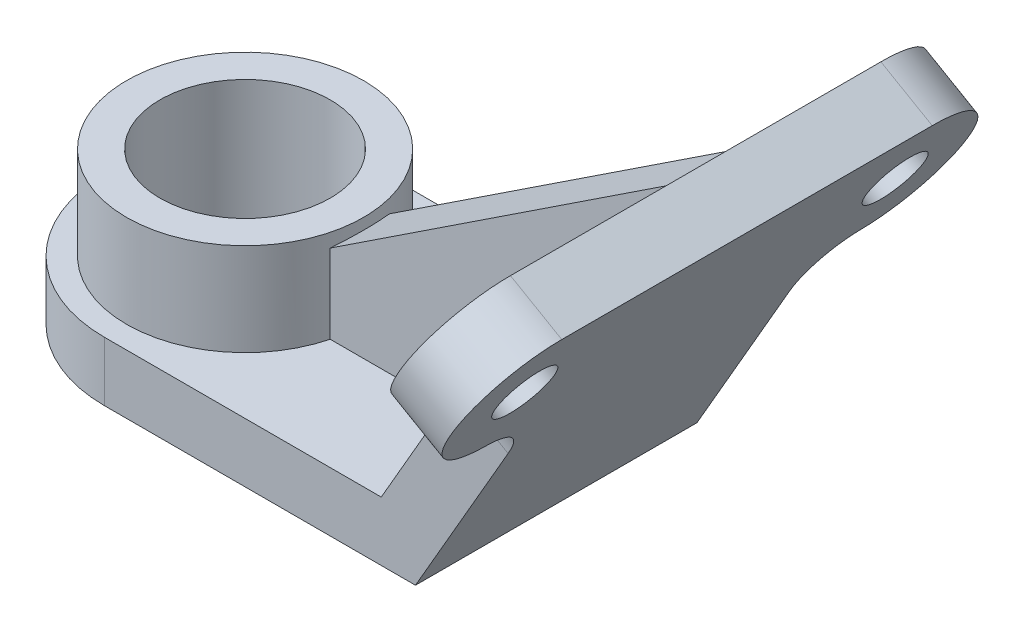
ISO-10303-21;
HEADER;
FILE_DESCRIPTION(('STEP AP214'),'2;1');
FILE_NAME('part.step','',(''),(''),'','','');
FILE_SCHEMA(('AUTOMOTIVE_DESIGN { 1 0 10303 214 1 1 1 1 }'));
ENDSEC;
DATA;
#1=APPLICATION_CONTEXT('core data for automotive mechanical design processes');
#2=APPLICATION_PROTOCOL_DEFINITION('international standard','automotive_design',2000,#1);
#3=PRODUCT_CONTEXT('',#1,'mechanical');
#4=PRODUCT('Part','Part','',(#3));
#5=PRODUCT_RELATED_PRODUCT_CATEGORY('part','',(#4));
#6=PRODUCT_DEFINITION_FORMATION('','',#4);
#7=PRODUCT_DEFINITION_CONTEXT('part definition',#1,'design');
#8=PRODUCT_DEFINITION('design','',#6,#7);
#9=PRODUCT_DEFINITION_SHAPE('','',#8);
#10=(LENGTH_UNIT() NAMED_UNIT(*) SI_UNIT(.MILLI.,.METRE.));
#11=(NAMED_UNIT(*) PLANE_ANGLE_UNIT() SI_UNIT($,.RADIAN.));
#12=(NAMED_UNIT(*) SI_UNIT($,.STERADIAN.) SOLID_ANGLE_UNIT());
#13=UNCERTAINTY_MEASURE_WITH_UNIT(LENGTH_MEASURE(1.E-05),#10,'distance_accuracy_value','');
#14=(GEOMETRIC_REPRESENTATION_CONTEXT(3) GLOBAL_UNCERTAINTY_ASSIGNED_CONTEXT((#13)) GLOBAL_UNIT_ASSIGNED_CONTEXT((#10,
#11,#12)) REPRESENTATION_CONTEXT('',''));
#15=CARTESIAN_POINT('',(0.,0.,0.));
#16=DIRECTION('',(0.,0.,1.));
#17=DIRECTION('',(1.,0.,0.));
#18=AXIS2_PLACEMENT_3D('',#15,#16,#17);
#19=CARTESIAN_POINT('',(112.762395692966,16.,38.));
#20=DIRECTION('',(0.86602540378444,-0.499999999999998,0.));
#21=DIRECTION('',(0.499999999999998,0.86602540378444,0.));
#22=AXIS2_PLACEMENT_3D('',#19,#20,#21);
#23=PLANE('',#22);
#24=CARTESIAN_POINT('',(149.643593539449,79.8801085141082,-50.000000000001));
#25=DIRECTION('',(-0.86602540378444,0.499999999999998,0.));
#26=DIRECTION('',(-0.499999999999998,-0.86602540378444,0.));
#27=AXIS2_PLACEMENT_3D('',#24,#25,#26);
#28=CIRCLE('',#27,7.99999999999999);
#29=CARTESIAN_POINT('',(145.643593539449,72.9519052838327,-50.000000000001));
#30=VERTEX_POINT('',#29);
#31=EDGE_CURVE('E216',#30,#30,#28,.F.);
#32=ORIENTED_EDGE('',*,*,#31,.T.);
#33=EDGE_LOOP('',(#32));
#34=FACE_BOUND('',#33,.T.);
#35=DIRECTION('',(-0.499999999999998,-0.86602540378444,0.));
#36=VECTOR('',#35,1.);
#37=CARTESIAN_POINT('',(112.762395692966,16.,-8.));
#38=LINE('',#37,#36);
#39=CARTESIAN_POINT('',(159.643593539449,97.2006165897973,-8.));
#40=VERTEX_POINT('',#39);
#41=CARTESIAN_POINT('',(112.762395692966,16.,-8.));
#42=VERTEX_POINT('',#41);
#43=EDGE_CURVE('E179',#40,#42,#38,.T.);
#44=ORIENTED_EDGE('',*,*,#43,.F.);
#45=DIRECTION('',(0.,0.,-1.));
#46=VECTOR('',#45,1.);
#47=CARTESIAN_POINT('',(159.643593539449,97.2006165897973,38.));
#48=LINE('',#47,#46);
#49=CARTESIAN_POINT('',(159.643593539449,97.2006165897973,-50.));
#50=VERTEX_POINT('',#49);
#51=EDGE_CURVE('E314',#40,#50,#48,.T.);
#52=ORIENTED_EDGE('',*,*,#51,.T.);
#53=CARTESIAN_POINT('',(149.643593539449,79.8801085141082,-50.000000000001));
#54=DIRECTION('',(-0.86602540378444,0.499999999999998,0.));
#55=DIRECTION('',(-0.499999999999998,-0.86602540378444,0.));
#56=AXIS2_PLACEMENT_3D('',#53,#54,#55);
#57=CIRCLE('',#56,20.0000000000002);
#58=CARTESIAN_POINT('',(139.648185962194,62.5675547479437,-50.6060606060615));
#59=VERTEX_POINT('',#58);
#60=EDGE_CURVE('E226',#59,#50,#57,.F.);
#61=ORIENTED_EDGE('',*,*,#60,.F.);
#62=CARTESIAN_POINT('',(133.151171036978,51.3143947999367,-51.0000000000008));
#63=DIRECTION('',(-0.86602540378444,0.499999999999998,0.));
#64=DIRECTION('',(-0.499999999999998,-0.86602540378444,0.));
#65=AXIS2_PLACEMENT_3D('',#62,#63,#64);
#66=CIRCLE('',#65,13.);
#67=CARTESIAN_POINT('',(133.151171036978,51.3143947999368,-38.));
#68=VERTEX_POINT('',#67);
#69=EDGE_CURVE('E221',#59,#68,#66,.F.);
#70=ORIENTED_EDGE('',*,*,#69,.T.);
#71=DIRECTION('',(-0.499999999999998,-0.86602540378444,0.));
#72=VECTOR('',#71,1.);
#73=CARTESIAN_POINT('',(112.762395692966,16.,-38.));
#74=LINE('',#73,#72);
#75=CARTESIAN_POINT('',(112.762395692966,16.,-38.));
#76=VERTEX_POINT('',#75);
#77=EDGE_CURVE('E304',#68,#76,#74,.T.);
#78=ORIENTED_EDGE('',*,*,#77,.T.);
#79=DIRECTION('',(0.,0.,-1.));
#80=VECTOR('',#79,1.);
#81=CARTESIAN_POINT('',(112.762395692966,16.,38.));
#82=LINE('',#81,#80);
#83=EDGE_CURVE('E296',#42,#76,#82,.T.);
#84=ORIENTED_EDGE('',*,*,#83,.F.);
#85=EDGE_LOOP('',(#44,#52,#61,#70,#78,#84));
#86=FACE_BOUND('',#85,.T.);
#87=ADVANCED_FACE('F47',(#34,#86),#23,.F.);
#88=CARTESIAN_POINT('',(0.,0.,38.));
#89=DIRECTION('',(0.,1.,0.));
#90=DIRECTION('',(0.,0.,1.));
#91=AXIS2_PLACEMENT_3D('',#88,#89,#90);
#92=PLANE('',#91);
#93=CARTESIAN_POINT('',(38.,0.,0.));
#94=DIRECTION('',(0.,1.,0.));
#95=DIRECTION('',(0.,0.,1.));
#96=AXIS2_PLACEMENT_3D('',#93,#94,#95);
#97=CIRCLE('',#96,23.);
#98=CARTESIAN_POINT('',(38.,0.,23.));
#99=VERTEX_POINT('',#98);
#100=EDGE_CURVE('E203',#99,#99,#97,.F.);
#101=ORIENTED_EDGE('',*,*,#100,.F.);
#102=EDGE_LOOP('',(#101));
#103=FACE_BOUND('',#102,.T.);
#104=DIRECTION('',(1.,0.,0.));
#105=VECTOR('',#104,1.);
#106=CARTESIAN_POINT('',(0.,0.,-38.));
#107=LINE('',#106,#105);
#108=CARTESIAN_POINT('',(38.,0.,-38.));
#109=VERTEX_POINT('',#108);
#110=CARTESIAN_POINT('',(122.,0.,-38.));
#111=VERTEX_POINT('',#110);
#112=EDGE_CURVE('E247',#109,#111,#107,.T.);
#113=ORIENTED_EDGE('',*,*,#112,.T.);
#114=DIRECTION('',(0.,0.,-1.));
#115=VECTOR('',#114,1.);
#116=CARTESIAN_POINT('',(122.,0.,38.));
#117=LINE('',#116,#115);
#118=CARTESIAN_POINT('',(122.,0.,38.));
#119=VERTEX_POINT('',#118);
#120=EDGE_CURVE('E321',#119,#111,#117,.T.);
#121=ORIENTED_EDGE('',*,*,#120,.F.);
#122=DIRECTION('',(1.,0.,0.));
#123=VECTOR('',#122,1.);
#124=CARTESIAN_POINT('',(0.,0.,38.));
#125=LINE('',#124,#123);
#126=CARTESIAN_POINT('',(38.,0.,38.));
#127=VERTEX_POINT('',#126);
#128=EDGE_CURVE('E282',#127,#119,#125,.T.);
#129=ORIENTED_EDGE('',*,*,#128,.F.);
#130=CARTESIAN_POINT('',(38.,0.,0.));
#131=DIRECTION('',(0.,1.,0.));
#132=DIRECTION('',(0.,0.,1.));
#133=AXIS2_PLACEMENT_3D('',#130,#131,#132);
#134=CIRCLE('',#133,38.);
#135=EDGE_CURVE('E193',#109,#127,#134,.T.);
#136=ORIENTED_EDGE('',*,*,#135,.F.);
#137=EDGE_LOOP('',(#113,#121,#129,#136));
#138=FACE_BOUND('',#137,.T.);
#139=ADVANCED_FACE('F49',(#103,#138),#92,.F.);
#140=CARTESIAN_POINT('',(0.,16.,38.));
#141=DIRECTION('',(0.,-1.,0.));
#142=DIRECTION('',(0.,0.,-1.));
#143=AXIS2_PLACEMENT_3D('',#140,#141,#142);
#144=PLANE('',#143);
#145=CARTESIAN_POINT('',(112.762395692966,16.,38.));
#146=VERTEX_POINT('',#145);
#147=CARTESIAN_POINT('',(112.762395692966,16.,8.));
#148=VERTEX_POINT('',#147);
#149=EDGE_CURVE('E311',#146,#148,#82,.T.);
#150=ORIENTED_EDGE('',*,*,#149,.T.);
#151=DIRECTION('',(-1.,0.,0.));
#152=VECTOR('',#151,1.);
#153=CARTESIAN_POINT('',(0.,16.,8.));
#154=LINE('',#153,#152);
#155=CARTESIAN_POINT('',(68.9838667696593,16.,8.));
#156=VERTEX_POINT('',#155);
#157=EDGE_CURVE('E182',#148,#156,#154,.T.);
#158=ORIENTED_EDGE('',*,*,#157,.T.);
#159=CARTESIAN_POINT('',(38.,16.,0.));
#160=DIRECTION('',(0.,-1.,0.));
#161=DIRECTION('',(0.,0.,-1.));
#162=AXIS2_PLACEMENT_3D('',#159,#160,#161);
#163=CIRCLE('',#162,32.);
#164=CARTESIAN_POINT('',(68.9838667696593,16.,-8.));
#165=VERTEX_POINT('',#164);
#166=EDGE_CURVE('E166',#165,#156,#163,.F.);
#167=ORIENTED_EDGE('',*,*,#166,.F.);
#168=DIRECTION('',(-1.,0.,0.));
#169=VECTOR('',#168,1.);
#170=CARTESIAN_POINT('',(0.,16.,-8.));
#171=LINE('',#170,#169);
#172=EDGE_CURVE('E63',#42,#165,#171,.T.);
#173=ORIENTED_EDGE('',*,*,#172,.F.);
#174=ORIENTED_EDGE('',*,*,#83,.T.);
#175=DIRECTION('',(-1.,0.,0.));
#176=VECTOR('',#175,1.);
#177=CARTESIAN_POINT('',(0.,16.,-38.));
#178=LINE('',#177,#176);
#179=CARTESIAN_POINT('',(38.,16.,-38.));
#180=VERTEX_POINT('',#179);
#181=EDGE_CURVE('E286',#76,#180,#178,.T.);
#182=ORIENTED_EDGE('',*,*,#181,.T.);
#183=CARTESIAN_POINT('',(38.,16.,0.));
#184=DIRECTION('',(0.,-1.,0.));
#185=DIRECTION('',(0.,0.,1.));
#186=AXIS2_PLACEMENT_3D('',#183,#184,#185);
#187=CIRCLE('',#186,38.);
#188=CARTESIAN_POINT('',(38.,16.,38.));
#189=VERTEX_POINT('',#188);
#190=EDGE_CURVE('E196',#189,#180,#187,.T.);
#191=ORIENTED_EDGE('',*,*,#190,.F.);
#192=DIRECTION('',(-1.,0.,0.));
#193=VECTOR('',#192,1.);
#194=CARTESIAN_POINT('',(0.,16.,38.));
#195=LINE('',#194,#193);
#196=EDGE_CURVE('E292',#146,#189,#195,.T.);
#197=ORIENTED_EDGE('',*,*,#196,.F.);
#198=EDGE_LOOP('',(#150,#158,#167,#173,#174,#182,#191,#197));
#199=FACE_BOUND('',#198,.T.);
#200=ADVANCED_FACE('F328',(#199),#144,.F.);
#201=CARTESIAN_POINT('',(0.,0.,38.));
#202=DIRECTION('',(0.,0.,-1.));
#203=DIRECTION('',(-1.,0.,0.));
#204=AXIS2_PLACEMENT_3D('',#201,#202,#203);
#205=PLANE('',#204);
#206=DIRECTION('',(0.,1.,0.));
#207=VECTOR('',#206,1.);
#208=CARTESIAN_POINT('',(38.,-0.001000000000001,38.));
#209=LINE('',#208,#207);
#210=EDGE_CURVE('E189',#127,#189,#209,.T.);
#211=ORIENTED_EDGE('',*,*,#210,.F.);
#212=ORIENTED_EDGE('',*,*,#128,.T.);
#213=DIRECTION('',(0.499999999999998,0.86602540378444,0.));
#214=VECTOR('',#213,1.);
#215=CARTESIAN_POINT('',(122.,0.,38.));
#216=LINE('',#215,#214);
#217=CARTESIAN_POINT('',(147.007577497529,43.3143947999371,38.));
#218=VERTEX_POINT('',#217);
#219=EDGE_CURVE('E285',#119,#218,#216,.T.);
#220=ORIENTED_EDGE('',*,*,#219,.T.);
#221=DIRECTION('',(-0.86602540378444,0.499999999999998,0.));
#222=VECTOR('',#221,1.);
#223=CARTESIAN_POINT('',(200.613037575289,12.3652679940088,38.));
#224=LINE('',#223,#222);
#225=CARTESIAN_POINT('',(133.151171036978,51.314394799937,38.));
#226=VERTEX_POINT('',#225);
#227=EDGE_CURVE('E258',#218,#226,#224,.T.);
#228=ORIENTED_EDGE('',*,*,#227,.T.);
#229=DIRECTION('',(-0.499999999999998,-0.86602540378444,0.));
#230=VECTOR('',#229,1.);
#231=CARTESIAN_POINT('',(112.762395692966,16.,38.));
#232=LINE('',#231,#230);
#233=EDGE_CURVE('E289',#226,#146,#232,.T.);
#234=ORIENTED_EDGE('',*,*,#233,.T.);
#235=ORIENTED_EDGE('',*,*,#196,.T.);
#236=EDGE_LOOP('',(#211,#212,#220,#228,#234,#235));
#237=FACE_BOUND('',#236,.T.);
#238=ADVANCED_FACE('F369',(#237),#205,.F.);
#239=CARTESIAN_POINT('',(0.,0.,-38.));
#240=DIRECTION('',(0.,0.,-1.));
#241=DIRECTION('',(-1.,0.,0.));
#242=AXIS2_PLACEMENT_3D('',#239,#240,#241);
#243=PLANE('',#242);
#244=DIRECTION('',(0.,1.,0.));
#245=VECTOR('',#244,1.);
#246=CARTESIAN_POINT('',(38.,-0.001000000000001,-38.));
#247=LINE('',#246,#245);
#248=EDGE_CURVE('E199',#109,#180,#247,.T.);
#249=ORIENTED_EDGE('',*,*,#248,.T.);
#250=ORIENTED_EDGE('',*,*,#181,.F.);
#251=ORIENTED_EDGE('',*,*,#77,.F.);
#252=DIRECTION('',(-0.86602540378444,0.499999999999998,0.));
#253=VECTOR('',#252,1.);
#254=CARTESIAN_POINT('',(200.613037575289,12.3652679940086,-38.));
#255=LINE('',#254,#253);
#256=CARTESIAN_POINT('',(147.007577497529,43.3143947999369,-38.));
#257=VERTEX_POINT('',#256);
#258=EDGE_CURVE('E225',#257,#68,#255,.T.);
#259=ORIENTED_EDGE('',*,*,#258,.F.);
#260=DIRECTION('',(0.499999999999998,0.86602540378444,0.));
#261=VECTOR('',#260,1.);
#262=CARTESIAN_POINT('',(122.,0.,-38.));
#263=LINE('',#262,#261);
#264=EDGE_CURVE('E300',#111,#257,#263,.T.);
#265=ORIENTED_EDGE('',*,*,#264,.F.);
#266=ORIENTED_EDGE('',*,*,#112,.F.);
#267=EDGE_LOOP('',(#249,#250,#251,#259,#265,#266));
#268=FACE_BOUND('',#267,.T.);
#269=ADVANCED_FACE('F358',(#268),#243,.T.);
#270=CARTESIAN_POINT('',(122.,0.,38.));
#271=DIRECTION('',(-0.86602540378444,0.499999999999998,0.));
#272=DIRECTION('',(-0.499999999999998,-0.86602540378444,0.));
#273=AXIS2_PLACEMENT_3D('',#270,#271,#272);
#274=PLANE('',#273);
#275=ORIENTED_EDGE('',*,*,#120,.T.);
#276=ORIENTED_EDGE('',*,*,#264,.T.);
#277=CARTESIAN_POINT('',(147.007577497529,43.3143947999368,-51.0000000000008));
#278=DIRECTION('',(-0.86602540378444,0.499999999999998,0.));
#279=DIRECTION('',(-0.499999999999998,-0.86602540378444,0.));
#280=AXIS2_PLACEMENT_3D('',#277,#278,#279);
#281=CIRCLE('',#280,13.);
#282=CARTESIAN_POINT('',(153.504592422745,54.5675547479437,-50.6060606060615));
#283=VERTEX_POINT('',#282);
#284=EDGE_CURVE('E244',#257,#283,#281,.T.);
#285=ORIENTED_EDGE('',*,*,#284,.T.);
#286=CARTESIAN_POINT('',(163.5,71.8801085141083,-50.000000000001));
#287=DIRECTION('',(-0.86602540378444,0.499999999999998,0.));
#288=DIRECTION('',(-0.499999999999998,-0.86602540378444,0.));
#289=AXIS2_PLACEMENT_3D('',#286,#287,#288);
#290=CIRCLE('',#289,20.0000000000002);
#291=CARTESIAN_POINT('',(173.5,89.2006165897974,-50.));
#292=VERTEX_POINT('',#291);
#293=EDGE_CURVE('E239',#292,#283,#290,.T.);
#294=ORIENTED_EDGE('',*,*,#293,.F.);
#295=DIRECTION('',(0.,0.,-1.));
#296=VECTOR('',#295,1.);
#297=CARTESIAN_POINT('',(173.5,89.2006165897973,38.));
#298=LINE('',#297,#296);
#299=CARTESIAN_POINT('',(173.5,89.2006165897974,50.));
#300=VERTEX_POINT('',#299);
#301=EDGE_CURVE('E318',#300,#292,#298,.T.);
#302=ORIENTED_EDGE('',*,*,#301,.F.);
#303=CARTESIAN_POINT('',(163.5,71.8801085141085,50.));
#304=DIRECTION('',(-0.86602540378444,0.499999999999998,0.));
#305=DIRECTION('',(-0.499999999999998,-0.86602540378444,0.));
#306=AXIS2_PLACEMENT_3D('',#303,#304,#305);
#307=CIRCLE('',#306,20.);
#308=CARTESIAN_POINT('',(153.504592422745,54.567554747944,50.6060606060606));
#309=VERTEX_POINT('',#308);
#310=EDGE_CURVE('E251',#300,#309,#307,.F.);
#311=ORIENTED_EDGE('',*,*,#310,.T.);
#312=CARTESIAN_POINT('',(147.007577497529,43.3143947999371,51.));
#313=DIRECTION('',(-0.86602540378444,0.499999999999998,0.));
#314=DIRECTION('',(-0.499999999999998,-0.86602540378444,0.));
#315=AXIS2_PLACEMENT_3D('',#312,#313,#314);
#316=CIRCLE('',#315,13.);
#317=EDGE_CURVE('E254',#218,#309,#316,.F.);
#318=ORIENTED_EDGE('',*,*,#317,.F.);
#319=ORIENTED_EDGE('',*,*,#219,.F.);
#320=EDGE_LOOP('',(#275,#276,#285,#294,#302,#311,#318,#319));
#321=FACE_BOUND('',#320,.T.);
#322=CARTESIAN_POINT('',(163.5,71.8801085141085,50.));
#323=DIRECTION('',(-0.86602540378444,0.499999999999998,0.));
#324=DIRECTION('',(-0.499999999999998,-0.86602540378444,0.));
#325=AXIS2_PLACEMENT_3D('',#322,#323,#324);
#326=CIRCLE('',#325,8.00000000000001);
#327=CARTESIAN_POINT('',(159.5,64.951905283833,50.));
#328=VERTEX_POINT('',#327);
#329=EDGE_CURVE('E243',#328,#328,#326,.F.);
#330=ORIENTED_EDGE('',*,*,#329,.F.);
#331=EDGE_LOOP('',(#330));
#332=FACE_BOUND('',#331,.T.);
#333=CARTESIAN_POINT('',(163.5,71.8801085141083,-50.000000000001));
#334=DIRECTION('',(-0.86602540378444,0.499999999999998,0.));
#335=DIRECTION('',(-0.499999999999998,-0.86602540378444,0.));
#336=AXIS2_PLACEMENT_3D('',#333,#334,#335);
#337=CIRCLE('',#336,7.99999999999999);
#338=CARTESIAN_POINT('',(159.5,64.9519052838327,-50.000000000001));
#339=VERTEX_POINT('',#338);
#340=EDGE_CURVE('E220',#339,#339,#337,.T.);
#341=ORIENTED_EDGE('',*,*,#340,.T.);
#342=EDGE_LOOP('',(#341));
#343=FACE_BOUND('',#342,.T.);
#344=ADVANCED_FACE('F371',(#321,#332,#343),#274,.F.);
#345=CARTESIAN_POINT('',(173.5,89.2006165897973,38.));
#346=DIRECTION('',(-0.499999999999999,-0.866025403784439,0.));
#347=DIRECTION('',(0.866025403784439,-0.499999999999999,0.));
#348=AXIS2_PLACEMENT_3D('',#345,#346,#347);
#349=PLANE('',#348);
#350=ORIENTED_EDGE('',*,*,#301,.T.);
#351=DIRECTION('',(-0.86602540378444,0.499999999999998,0.));
#352=VECTOR('',#351,1.);
#353=CARTESIAN_POINT('',(227.10546007776,58.2514897838691,-50.));
#354=LINE('',#353,#352);
#355=EDGE_CURVE('E230',#292,#50,#354,.T.);
#356=ORIENTED_EDGE('',*,*,#355,.T.);
#357=ORIENTED_EDGE('',*,*,#51,.F.);
#358=DIRECTION('',(0.,0.,-1.));
#359=VECTOR('',#358,1.);
#360=CARTESIAN_POINT('',(159.643593539449,97.2006165897972,38.));
#361=LINE('',#360,#359);
#362=CARTESIAN_POINT('',(159.643593539449,97.2006165897973,8.));
#363=VERTEX_POINT('',#362);
#364=EDGE_CURVE('E170',#40,#363,#361,.F.);
#365=ORIENTED_EDGE('',*,*,#364,.T.);
#366=CARTESIAN_POINT('',(159.643593539449,97.2006165897973,50.));
#367=VERTEX_POINT('',#366);
#368=EDGE_CURVE('E315',#367,#363,#48,.T.);
#369=ORIENTED_EDGE('',*,*,#368,.F.);
#370=DIRECTION('',(-0.86602540378444,0.499999999999998,0.));
#371=VECTOR('',#370,1.);
#372=CARTESIAN_POINT('',(227.10546007776,58.2514897838691,50.));
#373=LINE('',#372,#371);
#374=EDGE_CURVE('E273',#300,#367,#373,.T.);
#375=ORIENTED_EDGE('',*,*,#374,.F.);
#376=EDGE_LOOP('',(#350,#356,#357,#365,#369,#375));
#377=FACE_BOUND('',#376,.T.);
#378=ADVANCED_FACE('F346',(#377),#349,.F.);
#379=ORIENTED_EDGE('',*,*,#368,.T.);
#380=DIRECTION('',(-0.499999999999998,-0.86602540378444,0.));
#381=VECTOR('',#380,1.);
#382=CARTESIAN_POINT('',(112.762395692966,16.,8.));
#383=LINE('',#382,#381);
#384=EDGE_CURVE('E71',#363,#148,#383,.T.);
#385=ORIENTED_EDGE('',*,*,#384,.T.);
#386=ORIENTED_EDGE('',*,*,#149,.F.);
#387=ORIENTED_EDGE('',*,*,#233,.F.);
#388=CARTESIAN_POINT('',(133.151171036978,51.314394799937,51.));
#389=DIRECTION('',(-0.86602540378444,0.499999999999998,0.));
#390=DIRECTION('',(-0.499999999999998,-0.86602540378444,0.));
#391=AXIS2_PLACEMENT_3D('',#388,#389,#390);
#392=CIRCLE('',#391,13.);
#393=CARTESIAN_POINT('',(139.648185962194,62.567554747944,50.6060606060606));
#394=VERTEX_POINT('',#393);
#395=EDGE_CURVE('E215',#394,#226,#392,.T.);
#396=ORIENTED_EDGE('',*,*,#395,.F.);
#397=CARTESIAN_POINT('',(149.643593539449,79.8801085141085,50.));
#398=DIRECTION('',(-0.86602540378444,0.499999999999998,0.));
#399=DIRECTION('',(-0.499999999999998,-0.86602540378444,0.));
#400=AXIS2_PLACEMENT_3D('',#397,#398,#399);
#401=CIRCLE('',#400,20.);
#402=EDGE_CURVE('E262',#394,#367,#401,.T.);
#403=ORIENTED_EDGE('',*,*,#402,.T.);
#404=EDGE_LOOP('',(#379,#385,#386,#387,#396,#403));
#405=FACE_BOUND('',#404,.T.);
#406=CARTESIAN_POINT('',(149.643593539449,79.8801085141085,50.));
#407=DIRECTION('',(-0.86602540378444,0.499999999999998,0.));
#408=DIRECTION('',(-0.499999999999998,-0.86602540378444,0.));
#409=AXIS2_PLACEMENT_3D('',#406,#407,#408);
#410=CIRCLE('',#409,8.00000000000001);
#411=CARTESIAN_POINT('',(145.643593539449,72.951905283833,50.));
#412=VERTEX_POINT('',#411);
#413=EDGE_CURVE('E266',#412,#412,#410,.T.);
#414=ORIENTED_EDGE('',*,*,#413,.F.);
#415=EDGE_LOOP('',(#414));
#416=FACE_BOUND('',#415,.T.);
#417=ADVANCED_FACE('F331',(#405,#416),#23,.F.);
#418=CARTESIAN_POINT('',(217.10546007776,40.9309817081799,-50.000000000001));
#419=DIRECTION('',(-0.86602540378444,0.499999999999998,0.));
#420=DIRECTION('',(-0.499999999999998,-0.86602540378444,0.));
#421=AXIS2_PLACEMENT_3D('',#418,#419,#420);
#422=CYLINDRICAL_SURFACE('',#421,20.0000000000002);
#423=ORIENTED_EDGE('',*,*,#355,.F.);
#424=ORIENTED_EDGE('',*,*,#293,.T.);
#425=DIRECTION('',(-0.86602540378444,0.499999999999998,0.));
#426=VECTOR('',#425,1.);
#427=CARTESIAN_POINT('',(207.110052500505,23.6184279420154,-50.6060606060615));
#428=LINE('',#427,#426);
#429=EDGE_CURVE('E231',#283,#59,#428,.T.);
#430=ORIENTED_EDGE('',*,*,#429,.T.);
#431=ORIENTED_EDGE('',*,*,#60,.T.);
#432=EDGE_LOOP('',(#423,#424,#430,#431));
#433=FACE_BOUND('',#432,.T.);
#434=ADVANCED_FACE('F376',(#433),#422,.T.);
#435=CARTESIAN_POINT('',(200.613037575289,12.3652679940085,-51.0000000000008));
#436=DIRECTION('',(-0.86602540378444,0.499999999999998,0.));
#437=DIRECTION('',(-0.499999999999998,-0.86602540378444,0.));
#438=AXIS2_PLACEMENT_3D('',#435,#436,#437);
#439=CYLINDRICAL_SURFACE('',#438,13.);
#440=ORIENTED_EDGE('',*,*,#284,.F.);
#441=ORIENTED_EDGE('',*,*,#258,.T.);
#442=ORIENTED_EDGE('',*,*,#69,.F.);
#443=ORIENTED_EDGE('',*,*,#429,.F.);
#444=EDGE_LOOP('',(#440,#441,#442,#443));
#445=FACE_BOUND('',#444,.T.);
#446=ADVANCED_FACE('F378',(#445),#439,.F.);
#447=CARTESIAN_POINT('',(217.10546007776,40.9309817081799,-50.000000000001));
#448=DIRECTION('',(-0.86602540378444,0.499999999999998,0.));
#449=DIRECTION('',(-0.499999999999998,-0.86602540378444,0.));
#450=AXIS2_PLACEMENT_3D('',#447,#448,#449);
#451=CYLINDRICAL_SURFACE('',#450,7.99999999999999);
#452=ORIENTED_EDGE('',*,*,#340,.F.);
#453=EDGE_LOOP('',(#452));
#454=FACE_BOUND('',#453,.T.);
#455=ORIENTED_EDGE('',*,*,#31,.F.);
#456=EDGE_LOOP('',(#455));
#457=FACE_BOUND('',#456,.T.);
#458=ADVANCED_FACE('F380',(#454,#457),#451,.F.);
#459=CARTESIAN_POINT('',(217.10546007776,40.9309817081802,50.));
#460=DIRECTION('',(-0.86602540378444,0.499999999999998,0.));
#461=DIRECTION('',(-0.499999999999998,-0.86602540378444,0.));
#462=AXIS2_PLACEMENT_3D('',#459,#460,#461);
#463=CYLINDRICAL_SURFACE('',#462,20.);
#464=ORIENTED_EDGE('',*,*,#310,.F.);
#465=ORIENTED_EDGE('',*,*,#374,.T.);
#466=ORIENTED_EDGE('',*,*,#402,.F.);
#467=DIRECTION('',(-0.86602540378444,0.499999999999998,0.));
#468=VECTOR('',#467,1.);
#469=CARTESIAN_POINT('',(207.110052500505,23.6184279420157,50.6060606060606));
#470=LINE('',#469,#468);
#471=EDGE_CURVE('E270',#309,#394,#470,.T.);
#472=ORIENTED_EDGE('',*,*,#471,.F.);
#473=EDGE_LOOP('',(#464,#465,#466,#472));
#474=FACE_BOUND('',#473,.T.);
#475=ADVANCED_FACE('F343',(#474),#463,.T.);
#476=CARTESIAN_POINT('',(200.613037575289,12.3652679940088,51.));
#477=DIRECTION('',(-0.86602540378444,0.499999999999998,0.));
#478=DIRECTION('',(-0.499999999999998,-0.86602540378444,0.));
#479=AXIS2_PLACEMENT_3D('',#476,#477,#478);
#480=CYLINDRICAL_SURFACE('',#479,13.);
#481=ORIENTED_EDGE('',*,*,#227,.F.);
#482=ORIENTED_EDGE('',*,*,#317,.T.);
#483=ORIENTED_EDGE('',*,*,#471,.T.);
#484=ORIENTED_EDGE('',*,*,#395,.T.);
#485=EDGE_LOOP('',(#481,#482,#483,#484));
#486=FACE_BOUND('',#485,.T.);
#487=ADVANCED_FACE('F338',(#486),#480,.F.);
#488=CARTESIAN_POINT('',(217.10546007776,40.9309817081802,50.));
#489=DIRECTION('',(-0.86602540378444,0.499999999999998,0.));
#490=DIRECTION('',(-0.499999999999998,-0.86602540378444,0.));
#491=AXIS2_PLACEMENT_3D('',#488,#489,#490);
#492=CYLINDRICAL_SURFACE('',#491,8.00000000000001);
#493=ORIENTED_EDGE('',*,*,#329,.T.);
#494=EDGE_LOOP('',(#493));
#495=FACE_BOUND('',#494,.T.);
#496=ORIENTED_EDGE('',*,*,#413,.T.);
#497=EDGE_LOOP('',(#496));
#498=FACE_BOUND('',#497,.T.);
#499=ADVANCED_FACE('F474',(#495,#498),#492,.F.);
#500=CARTESIAN_POINT('',(38.,41.,0.));
#501=DIRECTION('',(0.,-1.,0.));
#502=DIRECTION('',(0.,0.,-1.));
#503=AXIS2_PLACEMENT_3D('',#500,#501,#502);
#504=CYLINDRICAL_SURFACE('',#503,23.);
#505=ORIENTED_EDGE('',*,*,#100,.T.);
#506=EDGE_LOOP('',(#505));
#507=FACE_BOUND('',#506,.T.);
#508=CARTESIAN_POINT('',(38.,41.,0.));
#509=DIRECTION('',(0.,1.,0.));
#510=DIRECTION('',(0.,0.,1.));
#511=AXIS2_PLACEMENT_3D('',#508,#509,#510);
#512=CIRCLE('',#511,23.);
#513=CARTESIAN_POINT('',(38.,41.,23.));
#514=VERTEX_POINT('',#513);
#515=EDGE_CURVE('E207',#514,#514,#512,.T.);
#516=ORIENTED_EDGE('',*,*,#515,.T.);
#517=EDGE_LOOP('',(#516));
#518=FACE_BOUND('',#517,.T.);
#519=ADVANCED_FACE('F464',(#507,#518),#504,.F.);
#520=CARTESIAN_POINT('',(38.,41.,0.));
#521=DIRECTION('',(0.,-1.,0.));
#522=DIRECTION('',(0.,0.,-1.));
#523=AXIS2_PLACEMENT_3D('',#520,#521,#522);
#524=CYLINDRICAL_SURFACE('',#523,32.);
#525=CARTESIAN_POINT('',(38.,41.,0.));
#526=DIRECTION('',(0.,1.,0.));
#527=DIRECTION('',(0.,0.,1.));
#528=AXIS2_PLACEMENT_3D('',#525,#526,#527);
#529=CIRCLE('',#528,32.);
#530=CARTESIAN_POINT('',(38.,41.,32.));
#531=VERTEX_POINT('',#530);
#532=EDGE_CURVE('E211',#531,#531,#529,.T.);
#533=ORIENTED_EDGE('',*,*,#532,.F.);
#534=EDGE_LOOP('',(#533));
#535=FACE_BOUND('',#534,.T.);
#536=ORIENTED_EDGE('',*,*,#166,.T.);
#537=DIRECTION('',(0.,-1.,0.));
#538=VECTOR('',#537,1.);
#539=CARTESIAN_POINT('',(68.9838667696593,41.,8.));
#540=LINE('',#539,#538);
#541=CARTESIAN_POINT('',(68.9838667696593,37.328945757322,8.));
#542=VERTEX_POINT('',#541);
#543=EDGE_CURVE('E11',#156,#542,#540,.F.);
#544=ORIENTED_EDGE('',*,*,#543,.T.);
#545=CARTESIAN_POINT('',(38.,16.8672044919769,0.));
#546=DIRECTION('',(0.551074609132322,-0.834455975573103,0.));
#547=DIRECTION('',(-0.834455975573103,-0.551074609132322,0.));
#548=AXIS2_PLACEMENT_3D('',#545,#546,#547);
#549=ELLIPSE('',#548,38.3483382427964,32.);
#550=CARTESIAN_POINT('',(68.9838667696593,37.328945757322,-8.));
#551=VERTEX_POINT('',#550);
#552=EDGE_CURVE('E56',#542,#551,#549,.F.);
#553=ORIENTED_EDGE('',*,*,#552,.T.);
#554=DIRECTION('',(0.,-1.,0.));
#555=VECTOR('',#554,1.);
#556=CARTESIAN_POINT('',(68.9838667696593,41.,-8.));
#557=LINE('',#556,#555);
#558=EDGE_CURVE('E153',#165,#551,#557,.F.);
#559=ORIENTED_EDGE('',*,*,#558,.F.);
#560=EDGE_LOOP('',(#536,#544,#553,#559));
#561=FACE_BOUND('',#560,.T.);
#562=ADVANCED_FACE('F152',(#535,#561),#524,.T.);
#563=CARTESIAN_POINT('',(0.,41.,0.));
#564=DIRECTION('',(0.,1.,0.));
#565=DIRECTION('',(0.,0.,1.));
#566=AXIS2_PLACEMENT_3D('',#563,#564,#565);
#567=PLANE('',#566);
#568=ORIENTED_EDGE('',*,*,#515,.F.);
#569=EDGE_LOOP('',(#568));
#570=FACE_BOUND('',#569,.T.);
#571=ORIENTED_EDGE('',*,*,#532,.T.);
#572=EDGE_LOOP('',(#571));
#573=FACE_BOUND('',#572,.T.);
#574=ADVANCED_FACE('F463',(#570,#573),#567,.T.);
#575=CARTESIAN_POINT('',(38.,-0.001000000000001,0.));
#576=DIRECTION('',(0.,1.,0.));
#577=DIRECTION('',(0.,0.,1.));
#578=AXIS2_PLACEMENT_3D('',#575,#576,#577);
#579=CYLINDRICAL_SURFACE('',#578,38.);
#580=ORIENTED_EDGE('',*,*,#135,.T.);
#581=ORIENTED_EDGE('',*,*,#210,.T.);
#582=ORIENTED_EDGE('',*,*,#190,.T.);
#583=ORIENTED_EDGE('',*,*,#248,.F.);
#584=EDGE_LOOP('',(#580,#581,#582,#583));
#585=FACE_BOUND('',#584,.T.);
#586=ADVANCED_FACE('F363',(#585),#579,.T.);
#587=CARTESIAN_POINT('',(70.,38.,0.));
#588=DIRECTION('',(0.551074609132322,-0.834455975573103,0.));
#589=DIRECTION('',(0.834455975573103,0.551074609132322,0.));
#590=AXIS2_PLACEMENT_3D('',#587,#588,#589);
#591=PLANE('',#590);
#592=ORIENTED_EDGE('',*,*,#364,.F.);
#593=DIRECTION('',(0.834455975573103,0.551074609132322,0.));
#594=VECTOR('',#593,1.);
#595=CARTESIAN_POINT('',(70.,38.,-8.));
#596=LINE('',#595,#594);
#597=EDGE_CURVE('E164',#551,#40,#596,.T.);
#598=ORIENTED_EDGE('',*,*,#597,.F.);
#599=ORIENTED_EDGE('',*,*,#552,.F.);
#600=DIRECTION('',(0.834455975573103,0.551074609132322,0.));
#601=VECTOR('',#600,1.);
#602=CARTESIAN_POINT('',(70.,38.,8.));
#603=LINE('',#602,#601);
#604=EDGE_CURVE('E172',#542,#363,#603,.T.);
#605=ORIENTED_EDGE('',*,*,#604,.T.);
#606=EDGE_LOOP('',(#592,#598,#599,#605));
#607=FACE_BOUND('',#606,.T.);
#608=ADVANCED_FACE('F169',(#607),#591,.F.);
#609=CARTESIAN_POINT('',(86.7499999999999,48.6003082948986,8.));
#610=DIRECTION('',(0.,0.,1.));
#611=DIRECTION('',(1.,0.,0.));
#612=AXIS2_PLACEMENT_3D('',#609,#610,#611);
#613=PLANE('',#612);
#614=ORIENTED_EDGE('',*,*,#384,.F.);
#615=ORIENTED_EDGE('',*,*,#604,.F.);
#616=ORIENTED_EDGE('',*,*,#543,.F.);
#617=ORIENTED_EDGE('',*,*,#157,.F.);
#618=EDGE_LOOP('',(#614,#615,#616,#617));
#619=FACE_BOUND('',#618,.T.);
#620=ADVANCED_FACE('F327',(#619),#613,.T.);
#621=CARTESIAN_POINT('',(86.7499999999999,48.6003082948986,-8.));
#622=DIRECTION('',(0.,0.,1.));
#623=DIRECTION('',(1.,0.,0.));
#624=AXIS2_PLACEMENT_3D('',#621,#622,#623);
#625=PLANE('',#624);
#626=ORIENTED_EDGE('',*,*,#597,.T.);
#627=ORIENTED_EDGE('',*,*,#43,.T.);
#628=ORIENTED_EDGE('',*,*,#172,.T.);
#629=ORIENTED_EDGE('',*,*,#558,.T.);
#630=EDGE_LOOP('',(#626,#627,#628,#629));
#631=FACE_BOUND('',#630,.T.);
#632=ADVANCED_FACE('F162',(#631),#625,.F.);
#633=CLOSED_SHELL('',(#87,#139,#200,#238,#269,#344,#378,#417,#434,#446,#458,#475,#487,#499,#519,
#562,#574,#586,#608,#620,#632));
#634=MANIFOLD_SOLID_BREP('B2',#633);
#635=ADVANCED_BREP_SHAPE_REPRESENTATION('',(#18,#634),#14);
#636=SHAPE_DEFINITION_REPRESENTATION(#9,#635);
ENDSEC;
END-ISO-10303-21;
